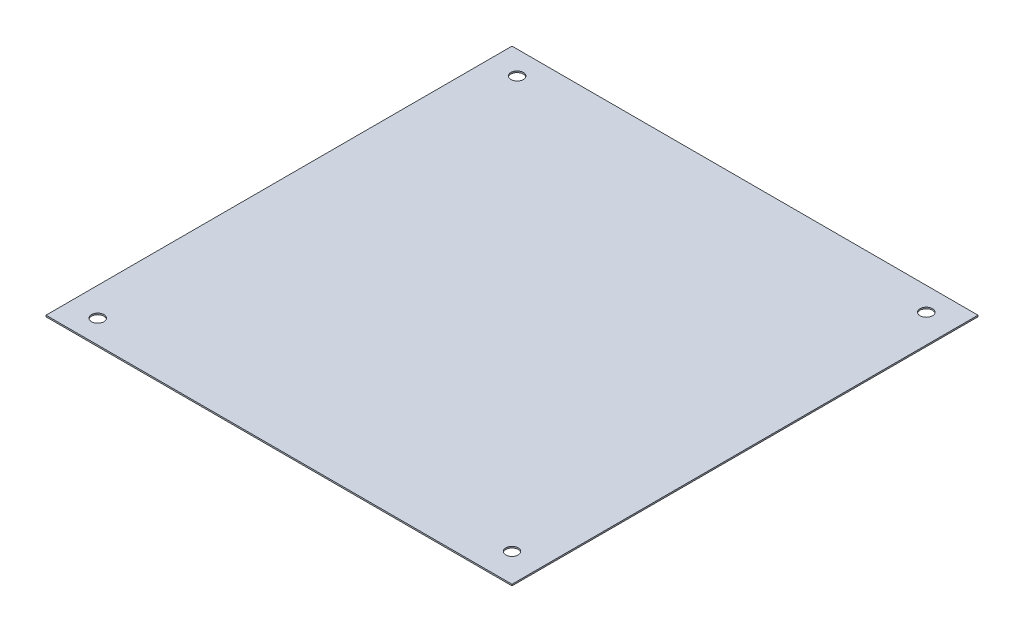
ISO-10303-21;
HEADER;
FILE_DESCRIPTION(('STEP AP214'),'2;1');
FILE_NAME('part.step','',(''),(''),'','','');
FILE_SCHEMA(('AUTOMOTIVE_DESIGN { 1 0 10303 214 1 1 1 1 }'));
ENDSEC;
DATA;
#1=APPLICATION_CONTEXT('core data for automotive mechanical design processes');
#2=APPLICATION_PROTOCOL_DEFINITION('international standard','automotive_design',2000,#1);
#3=PRODUCT_CONTEXT('',#1,'mechanical');
#4=PRODUCT('Part','Part','',(#3));
#5=PRODUCT_RELATED_PRODUCT_CATEGORY('part','',(#4));
#6=PRODUCT_DEFINITION_FORMATION('','',#4);
#7=PRODUCT_DEFINITION_CONTEXT('part definition',#1,'design');
#8=PRODUCT_DEFINITION('design','',#6,#7);
#9=PRODUCT_DEFINITION_SHAPE('','',#8);
#10=(LENGTH_UNIT() NAMED_UNIT(*) SI_UNIT(.MILLI.,.METRE.));
#11=(NAMED_UNIT(*) PLANE_ANGLE_UNIT() SI_UNIT($,.RADIAN.));
#12=(NAMED_UNIT(*) SI_UNIT($,.STERADIAN.) SOLID_ANGLE_UNIT());
#13=UNCERTAINTY_MEASURE_WITH_UNIT(LENGTH_MEASURE(1.E-05),#10,'distance_accuracy_value','');
#14=(GEOMETRIC_REPRESENTATION_CONTEXT(3) GLOBAL_UNCERTAINTY_ASSIGNED_CONTEXT((#13)) GLOBAL_UNIT_ASSIGNED_CONTEXT((#10,
#11,#12)) REPRESENTATION_CONTEXT('',''));
#15=CARTESIAN_POINT('',(0.,0.,0.));
#16=DIRECTION('',(0.,0.,1.));
#17=DIRECTION('',(1.,0.,0.));
#18=AXIS2_PLACEMENT_3D('',#15,#16,#17);
#19=CARTESIAN_POINT('',(0.,0.79375,0.));
#20=DIRECTION('',(0.,-1.,0.));
#21=DIRECTION('',(0.,0.,-1.));
#22=AXIS2_PLACEMENT_3D('',#19,#20,#21);
#23=PLANE('',#22);
#24=CARTESIAN_POINT('',(111.506,0.79375,111.506));
#25=DIRECTION('',(0.,1.,0.));
#26=DIRECTION('',(0.,0.,1.));
#27=AXIS2_PLACEMENT_3D('',#24,#25,#26);
#28=CIRCLE('',#27,3.37819999999999);
#29=CARTESIAN_POINT('',(111.506,0.79375,114.8842));
#30=VERTEX_POINT('',#29);
#31=EDGE_CURVE('E121',#30,#30,#28,.T.);
#32=ORIENTED_EDGE('',*,*,#31,.F.);
#33=EDGE_LOOP('',(#32));
#34=FACE_BOUND('',#33,.T.);
#35=CARTESIAN_POINT('',(-111.506,0.79375,-114.3));
#36=DIRECTION('',(0.,1.,0.));
#37=DIRECTION('',(0.,0.,1.));
#38=AXIS2_PLACEMENT_3D('',#35,#36,#37);
#39=CIRCLE('',#38,3.37819999999999);
#40=CARTESIAN_POINT('',(-111.506,0.79375,-110.9218));
#41=VERTEX_POINT('',#40);
#42=EDGE_CURVE('E100',#41,#41,#39,.T.);
#43=ORIENTED_EDGE('',*,*,#42,.F.);
#44=EDGE_LOOP('',(#43));
#45=FACE_BOUND('',#44,.T.);
#46=DIRECTION('',(0.,0.,-1.));
#47=VECTOR('',#46,1.);
#48=CARTESIAN_POINT('',(127.,0.79375,127.));
#49=LINE('',#48,#47);
#50=CARTESIAN_POINT('',(127.,0.79375,127.));
#51=VERTEX_POINT('',#50);
#52=CARTESIAN_POINT('',(127.,0.79375,-127.));
#53=VERTEX_POINT('',#52);
#54=EDGE_CURVE('E85',#51,#53,#49,.T.);
#55=ORIENTED_EDGE('',*,*,#54,.T.);
#56=DIRECTION('',(-1.,0.,0.));
#57=VECTOR('',#56,1.);
#58=CARTESIAN_POINT('',(-127.,0.79375,-127.));
#59=LINE('',#58,#57);
#60=CARTESIAN_POINT('',(-127.,0.79375,-127.));
#61=VERTEX_POINT('',#60);
#62=EDGE_CURVE('E80',#53,#61,#59,.T.);
#63=ORIENTED_EDGE('',*,*,#62,.T.);
#64=DIRECTION('',(0.,0.,1.));
#65=VECTOR('',#64,1.);
#66=CARTESIAN_POINT('',(-127.,0.79375,127.));
#67=LINE('',#66,#65);
#68=CARTESIAN_POINT('',(-127.,0.79375,127.));
#69=VERTEX_POINT('',#68);
#70=EDGE_CURVE('E83',#61,#69,#67,.T.);
#71=ORIENTED_EDGE('',*,*,#70,.T.);
#72=DIRECTION('',(1.,0.,0.));
#73=VECTOR('',#72,1.);
#74=CARTESIAN_POINT('',(-127.,0.79375,127.));
#75=LINE('',#74,#73);
#76=EDGE_CURVE('E50',#69,#51,#75,.T.);
#77=ORIENTED_EDGE('',*,*,#76,.T.);
#78=EDGE_LOOP('',(#55,#63,#71,#77));
#79=FACE_BOUND('',#78,.T.);
#80=CARTESIAN_POINT('',(111.506,0.79375,-114.3));
#81=DIRECTION('',(0.,1.,0.));
#82=DIRECTION('',(0.,0.,1.));
#83=AXIS2_PLACEMENT_3D('',#80,#81,#82);
#84=CIRCLE('',#83,3.37819999999999);
#85=CARTESIAN_POINT('',(111.506,0.79375,-110.9218));
#86=VERTEX_POINT('',#85);
#87=EDGE_CURVE('E115',#86,#86,#84,.T.);
#88=ORIENTED_EDGE('',*,*,#87,.F.);
#89=EDGE_LOOP('',(#88));
#90=FACE_BOUND('',#89,.T.);
#91=CARTESIAN_POINT('',(-111.506,0.79375,114.3));
#92=DIRECTION('',(0.,1.,0.));
#93=DIRECTION('',(0.,0.,1.));
#94=AXIS2_PLACEMENT_3D('',#91,#92,#93);
#95=CIRCLE('',#94,3.37819999999999);
#96=CARTESIAN_POINT('',(-111.506,0.79375,117.6782));
#97=VERTEX_POINT('',#96);
#98=EDGE_CURVE('E127',#97,#97,#95,.T.);
#99=ORIENTED_EDGE('',*,*,#98,.F.);
#100=EDGE_LOOP('',(#99));
#101=FACE_BOUND('',#100,.T.);
#102=ADVANCED_FACE('F33',(#34,#45,#79,#90,#101),#23,.F.);
#103=CARTESIAN_POINT('',(0.,0.,0.));
#104=DIRECTION('',(0.,-1.,0.));
#105=DIRECTION('',(0.,0.,-1.));
#106=AXIS2_PLACEMENT_3D('',#103,#104,#105);
#107=PLANE('',#106);
#108=CARTESIAN_POINT('',(111.506,0.,111.506));
#109=DIRECTION('',(0.,1.,0.));
#110=DIRECTION('',(0.,0.,1.));
#111=AXIS2_PLACEMENT_3D('',#108,#109,#110);
#112=CIRCLE('',#111,3.37819999999999);
#113=CARTESIAN_POINT('',(111.506,0.,114.8842));
#114=VERTEX_POINT('',#113);
#115=EDGE_CURVE('E124',#114,#114,#112,.T.);
#116=ORIENTED_EDGE('',*,*,#115,.T.);
#117=EDGE_LOOP('',(#116));
#118=FACE_BOUND('',#117,.T.);
#119=CARTESIAN_POINT('',(-111.506,0.,-114.3));
#120=DIRECTION('',(0.,1.,0.));
#121=DIRECTION('',(0.,0.,1.));
#122=AXIS2_PLACEMENT_3D('',#119,#120,#121);
#123=CIRCLE('',#122,3.37819999999999);
#124=CARTESIAN_POINT('',(-111.506,0.,-110.9218));
#125=VERTEX_POINT('',#124);
#126=EDGE_CURVE('E112',#125,#125,#123,.T.);
#127=ORIENTED_EDGE('',*,*,#126,.T.);
#128=EDGE_LOOP('',(#127));
#129=FACE_BOUND('',#128,.T.);
#130=DIRECTION('',(0.,0.,-1.));
#131=VECTOR('',#130,1.);
#132=CARTESIAN_POINT('',(127.,0.,127.));
#133=LINE('',#132,#131);
#134=CARTESIAN_POINT('',(127.,0.,127.));
#135=VERTEX_POINT('',#134);
#136=CARTESIAN_POINT('',(127.,0.,-127.));
#137=VERTEX_POINT('',#136);
#138=EDGE_CURVE('E97',#135,#137,#133,.T.);
#139=ORIENTED_EDGE('',*,*,#138,.F.);
#140=DIRECTION('',(1.,0.,0.));
#141=VECTOR('',#140,1.);
#142=CARTESIAN_POINT('',(-127.,0.,127.));
#143=LINE('',#142,#141);
#144=CARTESIAN_POINT('',(-127.,0.,127.));
#145=VERTEX_POINT('',#144);
#146=EDGE_CURVE('E73',#145,#135,#143,.T.);
#147=ORIENTED_EDGE('',*,*,#146,.F.);
#148=DIRECTION('',(0.,0.,1.));
#149=VECTOR('',#148,1.);
#150=CARTESIAN_POINT('',(-127.,0.,127.));
#151=LINE('',#150,#149);
#152=CARTESIAN_POINT('',(-127.,0.,-127.));
#153=VERTEX_POINT('',#152);
#154=EDGE_CURVE('E67',#153,#145,#151,.T.);
#155=ORIENTED_EDGE('',*,*,#154,.F.);
#156=DIRECTION('',(-1.,0.,0.));
#157=VECTOR('',#156,1.);
#158=CARTESIAN_POINT('',(-127.,0.,-127.));
#159=LINE('',#158,#157);
#160=EDGE_CURVE('E89',#137,#153,#159,.T.);
#161=ORIENTED_EDGE('',*,*,#160,.F.);
#162=EDGE_LOOP('',(#139,#147,#155,#161));
#163=FACE_BOUND('',#162,.T.);
#164=CARTESIAN_POINT('',(111.506,0.,-114.3));
#165=DIRECTION('',(0.,1.,0.));
#166=DIRECTION('',(0.,0.,1.));
#167=AXIS2_PLACEMENT_3D('',#164,#165,#166);
#168=CIRCLE('',#167,3.37819999999999);
#169=CARTESIAN_POINT('',(111.506,0.,-110.9218));
#170=VERTEX_POINT('',#169);
#171=EDGE_CURVE('E118',#170,#170,#168,.T.);
#172=ORIENTED_EDGE('',*,*,#171,.T.);
#173=EDGE_LOOP('',(#172));
#174=FACE_BOUND('',#173,.T.);
#175=CARTESIAN_POINT('',(-111.506,0.,114.3));
#176=DIRECTION('',(0.,1.,0.));
#177=DIRECTION('',(0.,0.,1.));
#178=AXIS2_PLACEMENT_3D('',#175,#176,#177);
#179=CIRCLE('',#178,3.37819999999999);
#180=CARTESIAN_POINT('',(-111.506,0.,117.6782));
#181=VERTEX_POINT('',#180);
#182=EDGE_CURVE('E130',#181,#181,#179,.T.);
#183=ORIENTED_EDGE('',*,*,#182,.T.);
#184=EDGE_LOOP('',(#183));
#185=FACE_BOUND('',#184,.T.);
#186=ADVANCED_FACE('F108',(#118,#129,#163,#174,#185),#107,.T.);
#187=CARTESIAN_POINT('',(127.,0.79375,127.));
#188=DIRECTION('',(-1.,0.,0.));
#189=DIRECTION('',(0.,0.,1.));
#190=AXIS2_PLACEMENT_3D('',#187,#188,#189);
#191=PLANE('',#190);
#192=ORIENTED_EDGE('',*,*,#138,.T.);
#193=DIRECTION('',(0.,-1.,0.));
#194=VECTOR('',#193,1.);
#195=CARTESIAN_POINT('',(127.,0.79375,-127.));
#196=LINE('',#195,#194);
#197=EDGE_CURVE('E11',#53,#137,#196,.T.);
#198=ORIENTED_EDGE('',*,*,#197,.F.);
#199=ORIENTED_EDGE('',*,*,#54,.F.);
#200=DIRECTION('',(0.,-1.,0.));
#201=VECTOR('',#200,1.);
#202=CARTESIAN_POINT('',(127.,0.79375,127.));
#203=LINE('',#202,#201);
#204=EDGE_CURVE('E93',#51,#135,#203,.T.);
#205=ORIENTED_EDGE('',*,*,#204,.T.);
#206=EDGE_LOOP('',(#192,#198,#199,#205));
#207=FACE_BOUND('',#206,.T.);
#208=ADVANCED_FACE('F35',(#207),#191,.F.);
#209=CARTESIAN_POINT('',(-127.,0.79375,-127.));
#210=DIRECTION('',(0.,0.,1.));
#211=DIRECTION('',(1.,0.,0.));
#212=AXIS2_PLACEMENT_3D('',#209,#210,#211);
#213=PLANE('',#212);
#214=ORIENTED_EDGE('',*,*,#160,.T.);
#215=DIRECTION('',(0.,-1.,0.));
#216=VECTOR('',#215,1.);
#217=CARTESIAN_POINT('',(-127.,0.79375,-127.));
#218=LINE('',#217,#216);
#219=EDGE_CURVE('E42',#61,#153,#218,.T.);
#220=ORIENTED_EDGE('',*,*,#219,.F.);
#221=ORIENTED_EDGE('',*,*,#62,.F.);
#222=ORIENTED_EDGE('',*,*,#197,.T.);
#223=EDGE_LOOP('',(#214,#220,#221,#222));
#224=FACE_BOUND('',#223,.T.);
#225=ADVANCED_FACE('F88',(#224),#213,.F.);
#226=CARTESIAN_POINT('',(-127.,0.79375,127.));
#227=DIRECTION('',(1.,0.,0.));
#228=DIRECTION('',(0.,0.,-1.));
#229=AXIS2_PLACEMENT_3D('',#226,#227,#228);
#230=PLANE('',#229);
#231=ORIENTED_EDGE('',*,*,#154,.T.);
#232=DIRECTION('',(0.,-1.,0.));
#233=VECTOR('',#232,1.);
#234=CARTESIAN_POINT('',(-127.,0.79375,127.));
#235=LINE('',#234,#233);
#236=EDGE_CURVE('E90',#69,#145,#235,.T.);
#237=ORIENTED_EDGE('',*,*,#236,.F.);
#238=ORIENTED_EDGE('',*,*,#70,.F.);
#239=ORIENTED_EDGE('',*,*,#219,.T.);
#240=EDGE_LOOP('',(#231,#237,#238,#239));
#241=FACE_BOUND('',#240,.T.);
#242=ADVANCED_FACE('F91',(#241),#230,.F.);
#243=CARTESIAN_POINT('',(-127.,0.79375,127.));
#244=DIRECTION('',(0.,0.,-1.));
#245=DIRECTION('',(-1.,0.,0.));
#246=AXIS2_PLACEMENT_3D('',#243,#244,#245);
#247=PLANE('',#246);
#248=ORIENTED_EDGE('',*,*,#146,.T.);
#249=ORIENTED_EDGE('',*,*,#204,.F.);
#250=ORIENTED_EDGE('',*,*,#76,.F.);
#251=ORIENTED_EDGE('',*,*,#236,.T.);
#252=EDGE_LOOP('',(#248,#249,#250,#251));
#253=FACE_BOUND('',#252,.T.);
#254=ADVANCED_FACE('F105',(#253),#247,.F.);
#255=CARTESIAN_POINT('',(-111.506,0.79375,-114.3));
#256=DIRECTION('',(0.,-1.,0.));
#257=DIRECTION('',(0.,0.,-1.));
#258=AXIS2_PLACEMENT_3D('',#255,#256,#257);
#259=CYLINDRICAL_SURFACE('',#258,3.37819999999999);
#260=ORIENTED_EDGE('',*,*,#42,.T.);
#261=EDGE_LOOP('',(#260));
#262=FACE_BOUND('',#261,.T.);
#263=ORIENTED_EDGE('',*,*,#126,.F.);
#264=EDGE_LOOP('',(#263));
#265=FACE_BOUND('',#264,.T.);
#266=ADVANCED_FACE('F150',(#262,#265),#259,.F.);
#267=CARTESIAN_POINT('',(111.506,0.79375,-114.3));
#268=DIRECTION('',(0.,-1.,0.));
#269=DIRECTION('',(0.,0.,-1.));
#270=AXIS2_PLACEMENT_3D('',#267,#268,#269);
#271=CYLINDRICAL_SURFACE('',#270,3.37819999999999);
#272=ORIENTED_EDGE('',*,*,#87,.T.);
#273=EDGE_LOOP('',(#272));
#274=FACE_BOUND('',#273,.T.);
#275=ORIENTED_EDGE('',*,*,#171,.F.);
#276=EDGE_LOOP('',(#275));
#277=FACE_BOUND('',#276,.T.);
#278=ADVANCED_FACE('F196',(#274,#277),#271,.F.);
#279=CARTESIAN_POINT('',(111.506,0.79375,111.506));
#280=DIRECTION('',(0.,-1.,0.));
#281=DIRECTION('',(0.,0.,-1.));
#282=AXIS2_PLACEMENT_3D('',#279,#280,#281);
#283=CYLINDRICAL_SURFACE('',#282,3.37819999999999);
#284=ORIENTED_EDGE('',*,*,#31,.T.);
#285=EDGE_LOOP('',(#284));
#286=FACE_BOUND('',#285,.T.);
#287=ORIENTED_EDGE('',*,*,#115,.F.);
#288=EDGE_LOOP('',(#287));
#289=FACE_BOUND('',#288,.T.);
#290=ADVANCED_FACE('F204',(#286,#289),#283,.F.);
#291=CARTESIAN_POINT('',(-111.506,0.79375,114.3));
#292=DIRECTION('',(0.,-1.,0.));
#293=DIRECTION('',(0.,0.,-1.));
#294=AXIS2_PLACEMENT_3D('',#291,#292,#293);
#295=CYLINDRICAL_SURFACE('',#294,3.37819999999999);
#296=ORIENTED_EDGE('',*,*,#98,.T.);
#297=EDGE_LOOP('',(#296));
#298=FACE_BOUND('',#297,.T.);
#299=ORIENTED_EDGE('',*,*,#182,.F.);
#300=EDGE_LOOP('',(#299));
#301=FACE_BOUND('',#300,.T.);
#302=ADVANCED_FACE('F136',(#298,#301),#295,.F.);
#303=CLOSED_SHELL('',(#102,#186,#208,#225,#242,#254,#266,#278,#290,#302));
#304=MANIFOLD_SOLID_BREP('B2',#303);
#305=ADVANCED_BREP_SHAPE_REPRESENTATION('',(#18,#304),#14);
#306=SHAPE_DEFINITION_REPRESENTATION(#9,#305);
ENDSEC;
END-ISO-10303-21;
